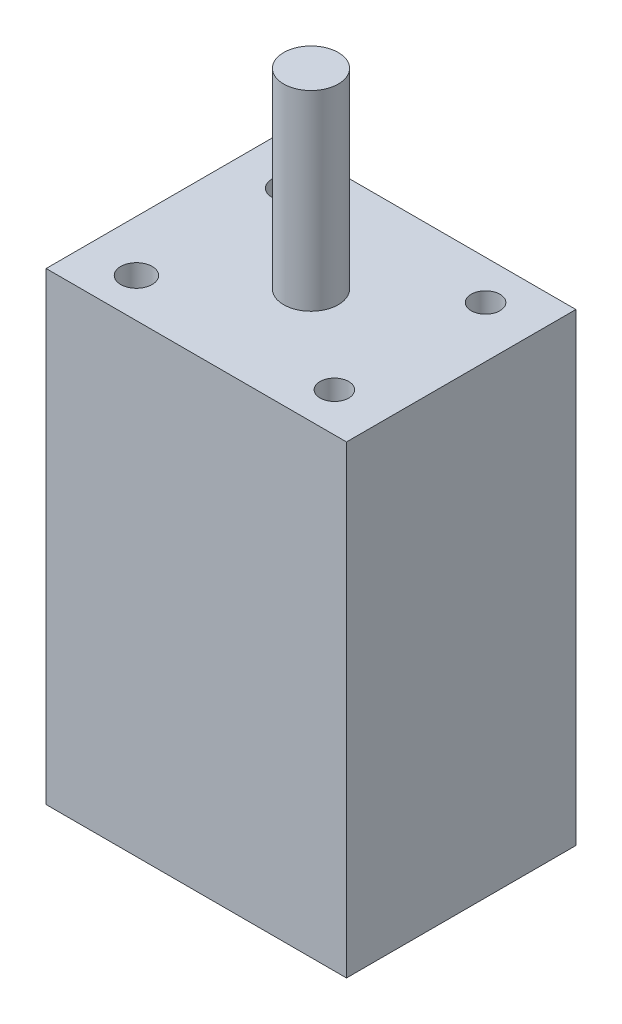
ISO-10303-21;
HEADER;
FILE_DESCRIPTION(('STEP AP214'),'2;1');
FILE_NAME('part.step','',(''),(''),'','','');
FILE_SCHEMA(('AUTOMOTIVE_DESIGN { 1 0 10303 214 1 1 1 1 }'));
ENDSEC;
DATA;
#1=APPLICATION_CONTEXT('core data for automotive mechanical design processes');
#2=APPLICATION_PROTOCOL_DEFINITION('international standard','automotive_design',2000,#1);
#3=PRODUCT_CONTEXT('',#1,'mechanical');
#4=PRODUCT('Part','Part','',(#3));
#5=PRODUCT_RELATED_PRODUCT_CATEGORY('part','',(#4));
#6=PRODUCT_DEFINITION_FORMATION('','',#4);
#7=PRODUCT_DEFINITION_CONTEXT('part definition',#1,'design');
#8=PRODUCT_DEFINITION('design','',#6,#7);
#9=PRODUCT_DEFINITION_SHAPE('','',#8);
#10=(LENGTH_UNIT() NAMED_UNIT(*) SI_UNIT(.MILLI.,.METRE.));
#11=(NAMED_UNIT(*) PLANE_ANGLE_UNIT() SI_UNIT($,.RADIAN.));
#12=(NAMED_UNIT(*) SI_UNIT($,.STERADIAN.) SOLID_ANGLE_UNIT());
#13=UNCERTAINTY_MEASURE_WITH_UNIT(LENGTH_MEASURE(1.E-05),#10,'distance_accuracy_value','');
#14=(GEOMETRIC_REPRESENTATION_CONTEXT(3) GLOBAL_UNCERTAINTY_ASSIGNED_CONTEXT((#13)) GLOBAL_UNIT_ASSIGNED_CONTEXT((#10,
#11,#12)) REPRESENTATION_CONTEXT('',''));
#15=CARTESIAN_POINT('',(0.,0.,0.));
#16=DIRECTION('',(0.,0.,1.));
#17=DIRECTION('',(1.,0.,0.));
#18=AXIS2_PLACEMENT_3D('',#15,#16,#17);
#19=CARTESIAN_POINT('',(0.,85.,0.));
#20=DIRECTION('',(0.,-1.,0.));
#21=DIRECTION('',(0.,0.,-1.));
#22=AXIS2_PLACEMENT_3D('',#19,#20,#21);
#23=PLANE('',#22);
#24=CARTESIAN_POINT('',(0.,85.,0.));
#25=DIRECTION('',(0.,-1.,0.));
#26=DIRECTION('',(0.,0.,-1.));
#27=AXIS2_PLACEMENT_3D('',#24,#25,#26);
#28=CIRCLE('',#27,5.);
#29=CARTESIAN_POINT('',(0.,85.,-5.));
#30=VERTEX_POINT('',#29);
#31=EDGE_CURVE('E11',#30,#30,#28,.F.);
#32=ORIENTED_EDGE('',*,*,#31,.F.);
#33=EDGE_LOOP('',(#32));
#34=FACE_BOUND('',#33,.T.);
#35=DIRECTION('',(0.,0.,-1.));
#36=VECTOR('',#35,1.);
#37=CARTESIAN_POINT('',(27.5,85.,21.));
#38=LINE('',#37,#36);
#39=CARTESIAN_POINT('',(27.5,85.,21.));
#40=VERTEX_POINT('',#39);
#41=CARTESIAN_POINT('',(27.5,85.,-21.));
#42=VERTEX_POINT('',#41);
#43=EDGE_CURVE('E93',#40,#42,#38,.T.);
#44=ORIENTED_EDGE('',*,*,#43,.T.);
#45=DIRECTION('',(-1.,0.,0.));
#46=VECTOR('',#45,1.);
#47=CARTESIAN_POINT('',(-27.5,85.,-21.));
#48=LINE('',#47,#46);
#49=CARTESIAN_POINT('',(-27.5,85.,-21.));
#50=VERTEX_POINT('',#49);
#51=EDGE_CURVE('E88',#42,#50,#48,.T.);
#52=ORIENTED_EDGE('',*,*,#51,.T.);
#53=DIRECTION('',(0.,0.,1.));
#54=VECTOR('',#53,1.);
#55=CARTESIAN_POINT('',(-27.5,85.,21.));
#56=LINE('',#55,#54);
#57=CARTESIAN_POINT('',(-27.5,85.,21.));
#58=VERTEX_POINT('',#57);
#59=EDGE_CURVE('E91',#50,#58,#56,.T.);
#60=ORIENTED_EDGE('',*,*,#59,.T.);
#61=DIRECTION('',(1.,0.,0.));
#62=VECTOR('',#61,1.);
#63=CARTESIAN_POINT('',(-27.5,85.,21.));
#64=LINE('',#63,#62);
#65=EDGE_CURVE('E57',#58,#40,#64,.T.);
#66=ORIENTED_EDGE('',*,*,#65,.T.);
#67=EDGE_LOOP('',(#44,#52,#60,#66));
#68=FACE_BOUND('',#67,.T.);
#69=CARTESIAN_POINT('',(-18.122781373982,85.,13.8392148674045));
#70=DIRECTION('',(0.,1.,0.));
#71=DIRECTION('',(0.,0.,1.));
#72=AXIS2_PLACEMENT_3D('',#69,#70,#71);
#73=CIRCLE('',#72,2.87727730355659);
#74=CARTESIAN_POINT('',(-18.122781373982,85.,16.7164921709611));
#75=VERTEX_POINT('',#74);
#76=EDGE_CURVE('E109',#75,#75,#73,.T.);
#77=ORIENTED_EDGE('',*,*,#76,.F.);
#78=EDGE_LOOP('',(#77));
#79=FACE_BOUND('',#78,.T.);
#80=CARTESIAN_POINT('',(18.1227813739821,85.,13.8392148674045));
#81=DIRECTION('',(0.,1.,0.));
#82=DIRECTION('',(0.,0.,1.));
#83=AXIS2_PLACEMENT_3D('',#80,#81,#82);
#84=CIRCLE('',#83,2.62721862601792);
#85=CARTESIAN_POINT('',(18.1227813739821,85.,16.4664334934224));
#86=VERTEX_POINT('',#85);
#87=EDGE_CURVE('E124',#86,#86,#84,.T.);
#88=ORIENTED_EDGE('',*,*,#87,.F.);
#89=EDGE_LOOP('',(#88));
#90=FACE_BOUND('',#89,.T.);
#91=CARTESIAN_POINT('',(-18.122781373982,85.,-13.8392148674045));
#92=DIRECTION('',(0.,1.,0.));
#93=DIRECTION('',(0.,0.,1.));
#94=AXIS2_PLACEMENT_3D('',#91,#92,#93);
#95=CIRCLE('',#94,2.87727730355659);
#96=CARTESIAN_POINT('',(-18.122781373982,85.,-10.9619375638479));
#97=VERTEX_POINT('',#96);
#98=EDGE_CURVE('E130',#97,#97,#95,.T.);
#99=ORIENTED_EDGE('',*,*,#98,.F.);
#100=EDGE_LOOP('',(#99));
#101=FACE_BOUND('',#100,.T.);
#102=CARTESIAN_POINT('',(18.1227813739821,85.,-13.8392148674045));
#103=DIRECTION('',(0.,1.,0.));
#104=DIRECTION('',(0.,0.,1.));
#105=AXIS2_PLACEMENT_3D('',#102,#103,#104);
#106=CIRCLE('',#105,2.6272186260179);
#107=CARTESIAN_POINT('',(18.1227813739821,85.,-11.2119962413866));
#108=VERTEX_POINT('',#107);
#109=EDGE_CURVE('E136',#108,#108,#106,.T.);
#110=ORIENTED_EDGE('',*,*,#109,.F.);
#111=EDGE_LOOP('',(#110));
#112=FACE_BOUND('',#111,.T.);
#113=ADVANCED_FACE('F39',(#34,#68,#79,#90,#101,#112),#23,.F.);
#114=CARTESIAN_POINT('',(0.,0.,0.));
#115=DIRECTION('',(0.,-1.,0.));
#116=DIRECTION('',(0.,0.,-1.));
#117=AXIS2_PLACEMENT_3D('',#114,#115,#116);
#118=PLANE('',#117);
#119=CARTESIAN_POINT('',(-18.122781373982,0.,-13.8392148674045));
#120=DIRECTION('',(0.,1.,0.));
#121=DIRECTION('',(0.,0.,1.));
#122=AXIS2_PLACEMENT_3D('',#119,#120,#121);
#123=CIRCLE('',#122,2.87727730355659);
#124=CARTESIAN_POINT('',(-18.122781373982,0.,-10.9619375638479));
#125=VERTEX_POINT('',#124);
#126=EDGE_CURVE('E133',#125,#125,#123,.T.);
#127=ORIENTED_EDGE('',*,*,#126,.T.);
#128=EDGE_LOOP('',(#127));
#129=FACE_BOUND('',#128,.T.);
#130=CARTESIAN_POINT('',(-18.122781373982,0.,13.8392148674045));
#131=DIRECTION('',(0.,1.,0.));
#132=DIRECTION('',(0.,0.,1.));
#133=AXIS2_PLACEMENT_3D('',#130,#131,#132);
#134=CIRCLE('',#133,2.87727730355659);
#135=CARTESIAN_POINT('',(-18.122781373982,0.,16.7164921709611));
#136=VERTEX_POINT('',#135);
#137=EDGE_CURVE('E121',#136,#136,#134,.T.);
#138=ORIENTED_EDGE('',*,*,#137,.T.);
#139=EDGE_LOOP('',(#138));
#140=FACE_BOUND('',#139,.T.);
#141=DIRECTION('',(0.,0.,-1.));
#142=VECTOR('',#141,1.);
#143=CARTESIAN_POINT('',(27.5,0.,21.));
#144=LINE('',#143,#142);
#145=CARTESIAN_POINT('',(27.5,0.,21.));
#146=VERTEX_POINT('',#145);
#147=CARTESIAN_POINT('',(27.5,0.,-21.));
#148=VERTEX_POINT('',#147);
#149=EDGE_CURVE('E106',#146,#148,#144,.T.);
#150=ORIENTED_EDGE('',*,*,#149,.F.);
#151=DIRECTION('',(1.,0.,0.));
#152=VECTOR('',#151,1.);
#153=CARTESIAN_POINT('',(-27.5,0.,21.));
#154=LINE('',#153,#152);
#155=CARTESIAN_POINT('',(-27.5,0.,21.));
#156=VERTEX_POINT('',#155);
#157=EDGE_CURVE('E80',#156,#146,#154,.T.);
#158=ORIENTED_EDGE('',*,*,#157,.F.);
#159=DIRECTION('',(0.,0.,1.));
#160=VECTOR('',#159,1.);
#161=CARTESIAN_POINT('',(-27.5,0.,21.));
#162=LINE('',#161,#160);
#163=CARTESIAN_POINT('',(-27.5,0.,-21.));
#164=VERTEX_POINT('',#163);
#165=EDGE_CURVE('E74',#164,#156,#162,.T.);
#166=ORIENTED_EDGE('',*,*,#165,.F.);
#167=DIRECTION('',(-1.,0.,0.));
#168=VECTOR('',#167,1.);
#169=CARTESIAN_POINT('',(-27.5,0.,-21.));
#170=LINE('',#169,#168);
#171=EDGE_CURVE('E98',#148,#164,#170,.T.);
#172=ORIENTED_EDGE('',*,*,#171,.F.);
#173=EDGE_LOOP('',(#150,#158,#166,#172));
#174=FACE_BOUND('',#173,.T.);
#175=CARTESIAN_POINT('',(18.1227813739821,0.,13.8392148674045));
#176=DIRECTION('',(0.,1.,0.));
#177=DIRECTION('',(0.,0.,1.));
#178=AXIS2_PLACEMENT_3D('',#175,#176,#177);
#179=CIRCLE('',#178,2.62721862601792);
#180=CARTESIAN_POINT('',(18.1227813739821,0.,16.4664334934224));
#181=VERTEX_POINT('',#180);
#182=EDGE_CURVE('E127',#181,#181,#179,.T.);
#183=ORIENTED_EDGE('',*,*,#182,.T.);
#184=EDGE_LOOP('',(#183));
#185=FACE_BOUND('',#184,.T.);
#186=CARTESIAN_POINT('',(18.1227813739821,0.,-13.8392148674045));
#187=DIRECTION('',(0.,1.,0.));
#188=DIRECTION('',(0.,0.,1.));
#189=AXIS2_PLACEMENT_3D('',#186,#187,#188);
#190=CIRCLE('',#189,2.6272186260179);
#191=CARTESIAN_POINT('',(18.1227813739821,0.,-11.2119962413866));
#192=VERTEX_POINT('',#191);
#193=EDGE_CURVE('E139',#192,#192,#190,.T.);
#194=ORIENTED_EDGE('',*,*,#193,.T.);
#195=EDGE_LOOP('',(#194));
#196=FACE_BOUND('',#195,.T.);
#197=ADVANCED_FACE('F117',(#129,#140,#174,#185,#196),#118,.T.);
#198=CARTESIAN_POINT('',(27.5,85.,21.));
#199=DIRECTION('',(-1.,0.,0.));
#200=DIRECTION('',(0.,0.,1.));
#201=AXIS2_PLACEMENT_3D('',#198,#199,#200);
#202=PLANE('',#201);
#203=ORIENTED_EDGE('',*,*,#149,.T.);
#204=DIRECTION('',(0.,-1.,0.));
#205=VECTOR('',#204,1.);
#206=CARTESIAN_POINT('',(27.5,85.,-21.));
#207=LINE('',#206,#205);
#208=EDGE_CURVE('E43',#42,#148,#207,.T.);
#209=ORIENTED_EDGE('',*,*,#208,.F.);
#210=ORIENTED_EDGE('',*,*,#43,.F.);
#211=DIRECTION('',(0.,-1.,0.));
#212=VECTOR('',#211,1.);
#213=CARTESIAN_POINT('',(27.5,85.,21.));
#214=LINE('',#213,#212);
#215=EDGE_CURVE('E102',#40,#146,#214,.T.);
#216=ORIENTED_EDGE('',*,*,#215,.T.);
#217=EDGE_LOOP('',(#203,#209,#210,#216));
#218=FACE_BOUND('',#217,.T.);
#219=ADVANCED_FACE('F41',(#218),#202,.F.);
#220=CARTESIAN_POINT('',(-27.5,85.,-21.));
#221=DIRECTION('',(0.,0.,1.));
#222=DIRECTION('',(1.,0.,0.));
#223=AXIS2_PLACEMENT_3D('',#220,#221,#222);
#224=PLANE('',#223);
#225=ORIENTED_EDGE('',*,*,#171,.T.);
#226=DIRECTION('',(0.,-1.,0.));
#227=VECTOR('',#226,1.);
#228=CARTESIAN_POINT('',(-27.5,85.,-21.));
#229=LINE('',#228,#227);
#230=EDGE_CURVE('E96',#50,#164,#229,.T.);
#231=ORIENTED_EDGE('',*,*,#230,.F.);
#232=ORIENTED_EDGE('',*,*,#51,.F.);
#233=ORIENTED_EDGE('',*,*,#208,.T.);
#234=EDGE_LOOP('',(#225,#231,#232,#233));
#235=FACE_BOUND('',#234,.T.);
#236=ADVANCED_FACE('F97',(#235),#224,.F.);
#237=CARTESIAN_POINT('',(-27.5,85.,21.));
#238=DIRECTION('',(1.,0.,0.));
#239=DIRECTION('',(0.,0.,-1.));
#240=AXIS2_PLACEMENT_3D('',#237,#238,#239);
#241=PLANE('',#240);
#242=ORIENTED_EDGE('',*,*,#165,.T.);
#243=DIRECTION('',(0.,-1.,0.));
#244=VECTOR('',#243,1.);
#245=CARTESIAN_POINT('',(-27.5,85.,21.));
#246=LINE('',#245,#244);
#247=EDGE_CURVE('E99',#58,#156,#246,.T.);
#248=ORIENTED_EDGE('',*,*,#247,.F.);
#249=ORIENTED_EDGE('',*,*,#59,.F.);
#250=ORIENTED_EDGE('',*,*,#230,.T.);
#251=EDGE_LOOP('',(#242,#248,#249,#250));
#252=FACE_BOUND('',#251,.T.);
#253=ADVANCED_FACE('F100',(#252),#241,.F.);
#254=CARTESIAN_POINT('',(-27.5,85.,21.));
#255=DIRECTION('',(0.,0.,-1.));
#256=DIRECTION('',(-1.,0.,0.));
#257=AXIS2_PLACEMENT_3D('',#254,#255,#256);
#258=PLANE('',#257);
#259=ORIENTED_EDGE('',*,*,#157,.T.);
#260=ORIENTED_EDGE('',*,*,#215,.F.);
#261=ORIENTED_EDGE('',*,*,#65,.F.);
#262=ORIENTED_EDGE('',*,*,#247,.T.);
#263=EDGE_LOOP('',(#259,#260,#261,#262));
#264=FACE_BOUND('',#263,.T.);
#265=ADVANCED_FACE('F114',(#264),#258,.F.);
#266=CARTESIAN_POINT('',(-18.122781373982,85.,13.8392148674045));
#267=DIRECTION('',(0.,-1.,0.));
#268=DIRECTION('',(0.,0.,-1.));
#269=AXIS2_PLACEMENT_3D('',#266,#267,#268);
#270=CYLINDRICAL_SURFACE('',#269,2.87727730355659);
#271=ORIENTED_EDGE('',*,*,#76,.T.);
#272=EDGE_LOOP('',(#271));
#273=FACE_BOUND('',#272,.T.);
#274=ORIENTED_EDGE('',*,*,#137,.F.);
#275=EDGE_LOOP('',(#274));
#276=FACE_BOUND('',#275,.T.);
#277=ADVANCED_FACE('F165',(#273,#276),#270,.F.);
#278=CARTESIAN_POINT('',(18.1227813739821,85.,13.8392148674045));
#279=DIRECTION('',(0.,-1.,0.));
#280=DIRECTION('',(0.,0.,-1.));
#281=AXIS2_PLACEMENT_3D('',#278,#279,#280);
#282=CYLINDRICAL_SURFACE('',#281,2.62721862601792);
#283=ORIENTED_EDGE('',*,*,#87,.T.);
#284=EDGE_LOOP('',(#283));
#285=FACE_BOUND('',#284,.T.);
#286=ORIENTED_EDGE('',*,*,#182,.F.);
#287=EDGE_LOOP('',(#286));
#288=FACE_BOUND('',#287,.T.);
#289=ADVANCED_FACE('F221',(#285,#288),#282,.F.);
#290=CARTESIAN_POINT('',(-18.122781373982,85.,-13.8392148674045));
#291=DIRECTION('',(0.,-1.,0.));
#292=DIRECTION('',(0.,0.,-1.));
#293=AXIS2_PLACEMENT_3D('',#290,#291,#292);
#294=CYLINDRICAL_SURFACE('',#293,2.87727730355659);
#295=ORIENTED_EDGE('',*,*,#98,.T.);
#296=EDGE_LOOP('',(#295));
#297=FACE_BOUND('',#296,.T.);
#298=ORIENTED_EDGE('',*,*,#126,.F.);
#299=EDGE_LOOP('',(#298));
#300=FACE_BOUND('',#299,.T.);
#301=ADVANCED_FACE('F212',(#297,#300),#294,.F.);
#302=CARTESIAN_POINT('',(18.1227813739821,85.,-13.8392148674045));
#303=DIRECTION('',(0.,-1.,0.));
#304=DIRECTION('',(0.,0.,-1.));
#305=AXIS2_PLACEMENT_3D('',#302,#303,#304);
#306=CYLINDRICAL_SURFACE('',#305,2.6272186260179);
#307=ORIENTED_EDGE('',*,*,#109,.T.);
#308=EDGE_LOOP('',(#307));
#309=FACE_BOUND('',#308,.T.);
#310=ORIENTED_EDGE('',*,*,#193,.F.);
#311=EDGE_LOOP('',(#310));
#312=FACE_BOUND('',#311,.T.);
#313=ADVANCED_FACE('F153',(#309,#312),#306,.F.);
#314=CARTESIAN_POINT('',(0.,120.,0.));
#315=DIRECTION('',(0.,-1.,0.));
#316=DIRECTION('',(0.,0.,-1.));
#317=AXIS2_PLACEMENT_3D('',#314,#315,#316);
#318=CYLINDRICAL_SURFACE('',#317,5.);
#319=CARTESIAN_POINT('',(0.,120.,0.));
#320=DIRECTION('',(0.,1.,0.));
#321=DIRECTION('',(0.,0.,1.));
#322=AXIS2_PLACEMENT_3D('',#319,#320,#321);
#323=CIRCLE('',#322,5.);
#324=CARTESIAN_POINT('',(0.,120.,5.));
#325=VERTEX_POINT('',#324);
#326=EDGE_CURVE('E142',#325,#325,#323,.T.);
#327=ORIENTED_EDGE('',*,*,#326,.F.);
#328=EDGE_LOOP('',(#327));
#329=FACE_BOUND('',#328,.T.);
#330=ORIENTED_EDGE('',*,*,#31,.T.);
#331=EDGE_LOOP('',(#330));
#332=FACE_BOUND('',#331,.T.);
#333=ADVANCED_FACE('F150',(#329,#332),#318,.T.);
#334=CARTESIAN_POINT('',(0.,120.,0.));
#335=DIRECTION('',(0.,1.,0.));
#336=DIRECTION('',(0.,0.,1.));
#337=AXIS2_PLACEMENT_3D('',#334,#335,#336);
#338=PLANE('',#337);
#339=ORIENTED_EDGE('',*,*,#326,.T.);
#340=EDGE_LOOP('',(#339));
#341=FACE_BOUND('',#340,.T.);
#342=ADVANCED_FACE('F148',(#341),#338,.T.);
#343=CLOSED_SHELL('',(#113,#197,#219,#236,#253,#265,#277,#289,#301,#313,#333,#342));
#344=MANIFOLD_SOLID_BREP('B2',#343);
#345=ADVANCED_BREP_SHAPE_REPRESENTATION('',(#18,#344),#14);
#346=SHAPE_DEFINITION_REPRESENTATION(#9,#345);
ENDSEC;
END-ISO-10303-21;
